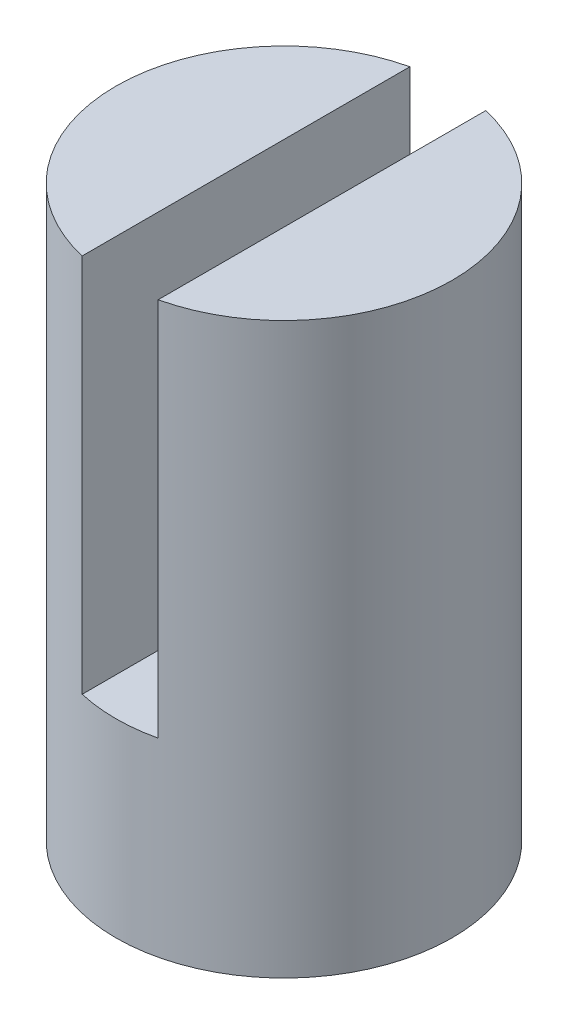
ISO-10303-21;
HEADER;
FILE_DESCRIPTION(('STEP AP214'),'2;1');
FILE_NAME('part.step','',(''),(''),'','','');
FILE_SCHEMA(('AUTOMOTIVE_DESIGN { 1 0 10303 214 1 1 1 1 }'));
ENDSEC;
DATA;
#1=APPLICATION_CONTEXT('core data for automotive mechanical design processes');
#2=APPLICATION_PROTOCOL_DEFINITION('international standard','automotive_design',2000,#1);
#3=PRODUCT_CONTEXT('',#1,'mechanical');
#4=PRODUCT('Part','Part','',(#3));
#5=PRODUCT_RELATED_PRODUCT_CATEGORY('part','',(#4));
#6=PRODUCT_DEFINITION_FORMATION('','',#4);
#7=PRODUCT_DEFINITION_CONTEXT('part definition',#1,'design');
#8=PRODUCT_DEFINITION('design','',#6,#7);
#9=PRODUCT_DEFINITION_SHAPE('','',#8);
#10=(LENGTH_UNIT() NAMED_UNIT(*) SI_UNIT(.MILLI.,.METRE.));
#11=(NAMED_UNIT(*) PLANE_ANGLE_UNIT() SI_UNIT($,.RADIAN.));
#12=(NAMED_UNIT(*) SI_UNIT($,.STERADIAN.) SOLID_ANGLE_UNIT());
#13=UNCERTAINTY_MEASURE_WITH_UNIT(LENGTH_MEASURE(1.E-05),#10,'distance_accuracy_value','');
#14=(GEOMETRIC_REPRESENTATION_CONTEXT(3) GLOBAL_UNCERTAINTY_ASSIGNED_CONTEXT((#13)) GLOBAL_UNIT_ASSIGNED_CONTEXT((#10,
#11,#12)) REPRESENTATION_CONTEXT('',''));
#15=CARTESIAN_POINT('',(0.,0.,0.));
#16=DIRECTION('',(0.,0.,1.));
#17=DIRECTION('',(1.,0.,0.));
#18=AXIS2_PLACEMENT_3D('',#15,#16,#17);
#19=CARTESIAN_POINT('',(0.,6.35,0.));
#20=DIRECTION('',(0.,1.,0.));
#21=DIRECTION('',(0.,0.,1.));
#22=AXIS2_PLACEMENT_3D('',#19,#20,#21);
#23=PLANE('',#22);
#24=CARTESIAN_POINT('',(0.,6.35,0.));
#25=DIRECTION('',(0.,1.,0.));
#26=DIRECTION('',(0.,0.,1.));
#27=AXIS2_PLACEMENT_3D('',#24,#25,#26);
#28=CIRCLE('',#27,5.6261);
#29=CARTESIAN_POINT('',(-1.27,6.35,5.48088507542349));
#30=VERTEX_POINT('',#29);
#31=CARTESIAN_POINT('',(1.27,6.35,5.48088507542349));
#32=VERTEX_POINT('',#31);
#33=EDGE_CURVE('E11',#30,#32,#28,.T.);
#34=ORIENTED_EDGE('',*,*,#33,.T.);
#35=DIRECTION('',(0.,0.,1.));
#36=VECTOR('',#35,1.);
#37=CARTESIAN_POINT('',(1.27,6.35,0.));
#38=LINE('',#37,#36);
#39=CARTESIAN_POINT('',(1.27,6.35,-5.48088507542349));
#40=VERTEX_POINT('',#39);
#41=EDGE_CURVE('E106',#40,#32,#38,.T.);
#42=ORIENTED_EDGE('',*,*,#41,.F.);
#43=CARTESIAN_POINT('',(-1.27,6.35,-5.48088507542349));
#44=VERTEX_POINT('',#43);
#45=EDGE_CURVE('E57',#40,#44,#28,.T.);
#46=ORIENTED_EDGE('',*,*,#45,.T.);
#47=DIRECTION('',(0.,0.,1.));
#48=VECTOR('',#47,1.);
#49=CARTESIAN_POINT('',(-1.27,6.35,0.));
#50=LINE('',#49,#48);
#51=EDGE_CURVE('E111',#44,#30,#50,.T.);
#52=ORIENTED_EDGE('',*,*,#51,.T.);
#53=EDGE_LOOP('',(#34,#42,#46,#52));
#54=FACE_BOUND('',#53,.T.);
#55=ADVANCED_FACE('F47',(#54),#23,.T.);
#56=CARTESIAN_POINT('',(0.,6.35,0.));
#57=DIRECTION('',(0.,-1.,0.));
#58=DIRECTION('',(0.,0.,-1.));
#59=AXIS2_PLACEMENT_3D('',#56,#57,#58);
#60=CYLINDRICAL_SURFACE('',#59,5.6261);
#61=ORIENTED_EDGE('',*,*,#33,.F.);
#62=DIRECTION('',(0.,-1.,0.));
#63=VECTOR('',#62,1.);
#64=CARTESIAN_POINT('',(-1.27,19.05,5.48088507542349));
#65=LINE('',#64,#63);
#66=CARTESIAN_POINT('',(-1.27,19.05,5.48088507542349));
#67=VERTEX_POINT('',#66);
#68=EDGE_CURVE('E70',#67,#30,#65,.T.);
#69=ORIENTED_EDGE('',*,*,#68,.F.);
#70=CARTESIAN_POINT('',(0.,19.05,0.));
#71=DIRECTION('',(0.,1.,0.));
#72=DIRECTION('',(0.,0.,1.));
#73=AXIS2_PLACEMENT_3D('',#70,#71,#72);
#74=CIRCLE('',#73,5.6261);
#75=CARTESIAN_POINT('',(-1.27,19.05,-5.48088507542349));
#76=VERTEX_POINT('',#75);
#77=EDGE_CURVE('E115',#76,#67,#74,.T.);
#78=ORIENTED_EDGE('',*,*,#77,.F.);
#79=DIRECTION('',(0.,-1.,0.));
#80=VECTOR('',#79,1.);
#81=CARTESIAN_POINT('',(-1.27,19.05,-5.48088507542349));
#82=LINE('',#81,#80);
#83=EDGE_CURVE('E124',#76,#44,#82,.T.);
#84=ORIENTED_EDGE('',*,*,#83,.T.);
#85=ORIENTED_EDGE('',*,*,#45,.F.);
#86=DIRECTION('',(0.,-1.,0.));
#87=VECTOR('',#86,1.);
#88=CARTESIAN_POINT('',(1.27,19.05,-5.48088507542349));
#89=LINE('',#88,#87);
#90=CARTESIAN_POINT('',(1.27,19.05,-5.48088507542349));
#91=VERTEX_POINT('',#90);
#92=EDGE_CURVE('E95',#91,#40,#89,.T.);
#93=ORIENTED_EDGE('',*,*,#92,.F.);
#94=CARTESIAN_POINT('',(0.,19.05,0.));
#95=DIRECTION('',(0.,1.,0.));
#96=DIRECTION('',(0.,0.,1.));
#97=AXIS2_PLACEMENT_3D('',#94,#95,#96);
#98=CIRCLE('',#97,5.6261);
#99=CARTESIAN_POINT('',(1.27,19.05,5.48088507542349));
#100=VERTEX_POINT('',#99);
#101=EDGE_CURVE('E101',#100,#91,#98,.T.);
#102=ORIENTED_EDGE('',*,*,#101,.F.);
#103=DIRECTION('',(0.,-1.,0.));
#104=VECTOR('',#103,1.);
#105=CARTESIAN_POINT('',(1.27,19.05,5.48088507542349));
#106=LINE('',#105,#104);
#107=EDGE_CURVE('E97',#100,#32,#106,.T.);
#108=ORIENTED_EDGE('',*,*,#107,.T.);
#109=EDGE_LOOP('',(#61,#69,#78,#84,#85,#93,#102,#108));
#110=FACE_BOUND('',#109,.T.);
#111=CARTESIAN_POINT('',(0.,0.,0.));
#112=DIRECTION('',(0.,1.,0.));
#113=DIRECTION('',(0.,0.,1.));
#114=AXIS2_PLACEMENT_3D('',#111,#112,#113);
#115=CIRCLE('',#114,5.6261);
#116=CARTESIAN_POINT('',(0.,0.,5.6261));
#117=VERTEX_POINT('',#116);
#118=EDGE_CURVE('E51',#117,#117,#115,.T.);
#119=ORIENTED_EDGE('',*,*,#118,.T.);
#120=EDGE_LOOP('',(#119));
#121=FACE_BOUND('',#120,.T.);
#122=ADVANCED_FACE('F49',(#110,#121),#60,.T.);
#123=CARTESIAN_POINT('',(0.,0.,0.));
#124=DIRECTION('',(0.,1.,0.));
#125=DIRECTION('',(0.,0.,1.));
#126=AXIS2_PLACEMENT_3D('',#123,#124,#125);
#127=PLANE('',#126);
#128=ORIENTED_EDGE('',*,*,#118,.F.);
#129=EDGE_LOOP('',(#128));
#130=FACE_BOUND('',#129,.T.);
#131=ADVANCED_FACE('F138',(#130),#127,.F.);
#132=CARTESIAN_POINT('',(-1.27,19.05,0.));
#133=DIRECTION('',(1.,0.,0.));
#134=DIRECTION('',(0.,0.,-1.));
#135=AXIS2_PLACEMENT_3D('',#132,#133,#134);
#136=PLANE('',#135);
#137=ORIENTED_EDGE('',*,*,#51,.F.);
#138=ORIENTED_EDGE('',*,*,#83,.F.);
#139=DIRECTION('',(0.,0.,1.));
#140=VECTOR('',#139,1.);
#141=CARTESIAN_POINT('',(-1.27,19.05,0.));
#142=LINE('',#141,#140);
#143=EDGE_CURVE('E122',#76,#67,#142,.T.);
#144=ORIENTED_EDGE('',*,*,#143,.T.);
#145=ORIENTED_EDGE('',*,*,#68,.T.);
#146=EDGE_LOOP('',(#137,#138,#144,#145));
#147=FACE_BOUND('',#146,.T.);
#148=ADVANCED_FACE('F135',(#147),#136,.T.);
#149=CARTESIAN_POINT('',(0.,19.05,0.));
#150=DIRECTION('',(0.,1.,0.));
#151=DIRECTION('',(0.,0.,1.));
#152=AXIS2_PLACEMENT_3D('',#149,#150,#151);
#153=PLANE('',#152);
#154=ORIENTED_EDGE('',*,*,#77,.T.);
#155=ORIENTED_EDGE('',*,*,#143,.F.);
#156=EDGE_LOOP('',(#154,#155));
#157=FACE_BOUND('',#156,.T.);
#158=ADVANCED_FACE('F137',(#157),#153,.T.);
#159=CARTESIAN_POINT('',(1.27,19.05,0.));
#160=DIRECTION('',(1.,0.,0.));
#161=DIRECTION('',(0.,0.,-1.));
#162=AXIS2_PLACEMENT_3D('',#159,#160,#161);
#163=PLANE('',#162);
#164=ORIENTED_EDGE('',*,*,#41,.T.);
#165=ORIENTED_EDGE('',*,*,#107,.F.);
#166=DIRECTION('',(0.,0.,1.));
#167=VECTOR('',#166,1.);
#168=CARTESIAN_POINT('',(1.27,19.05,0.));
#169=LINE('',#168,#167);
#170=EDGE_CURVE('E91',#91,#100,#169,.T.);
#171=ORIENTED_EDGE('',*,*,#170,.F.);
#172=ORIENTED_EDGE('',*,*,#92,.T.);
#173=EDGE_LOOP('',(#164,#165,#171,#172));
#174=FACE_BOUND('',#173,.T.);
#175=ADVANCED_FACE('F93',(#174),#163,.F.);
#176=CARTESIAN_POINT('',(0.,19.05,0.));
#177=DIRECTION('',(0.,1.,0.));
#178=DIRECTION('',(0.,0.,1.));
#179=AXIS2_PLACEMENT_3D('',#176,#177,#178);
#180=PLANE('',#179);
#181=ORIENTED_EDGE('',*,*,#101,.T.);
#182=ORIENTED_EDGE('',*,*,#170,.T.);
#183=EDGE_LOOP('',(#181,#182));
#184=FACE_BOUND('',#183,.T.);
#185=ADVANCED_FACE('F103',(#184),#180,.T.);
#186=CLOSED_SHELL('',(#55,#122,#131,#148,#158,#175,#185));
#187=MANIFOLD_SOLID_BREP('B2',#186);
#188=ADVANCED_BREP_SHAPE_REPRESENTATION('',(#18,#187),#14);
#189=SHAPE_DEFINITION_REPRESENTATION(#9,#188);
ENDSEC;
END-ISO-10303-21;
